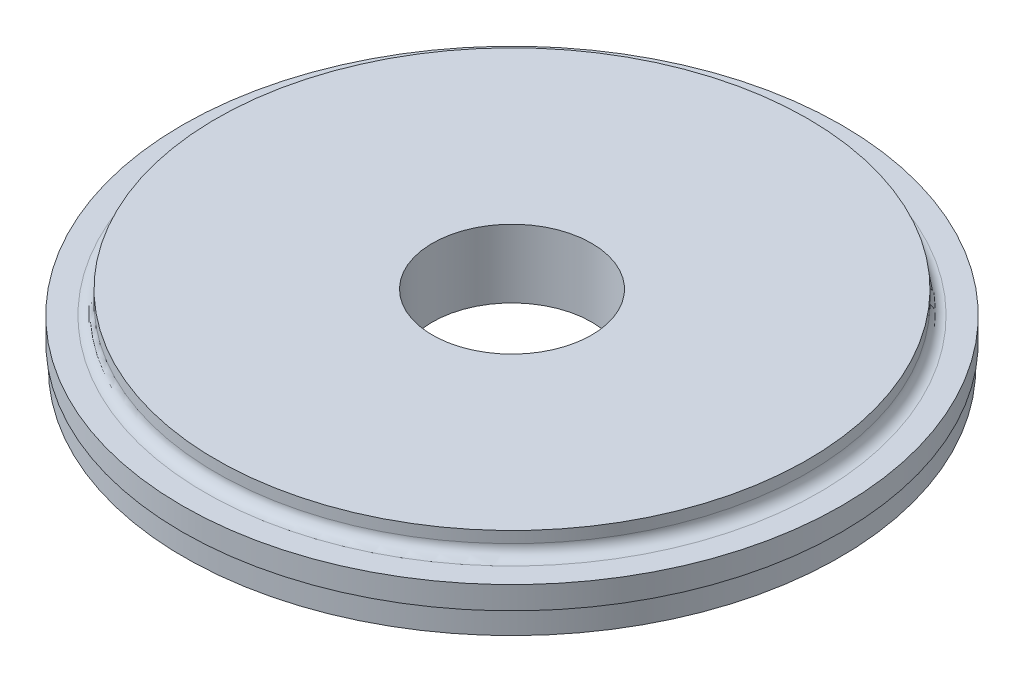
ISO-10303-21;
HEADER;
FILE_DESCRIPTION(('STEP AP214'),'2;1');
FILE_NAME('part.step','',(''),(''),'','','');
FILE_SCHEMA(('AUTOMOTIVE_DESIGN { 1 0 10303 214 1 1 1 1 }'));
ENDSEC;
DATA;
#1=APPLICATION_CONTEXT('core data for automotive mechanical design processes');
#2=APPLICATION_PROTOCOL_DEFINITION('international standard','automotive_design',2000,#1);
#3=PRODUCT_CONTEXT('',#1,'mechanical');
#4=PRODUCT('Part','Part','',(#3));
#5=PRODUCT_RELATED_PRODUCT_CATEGORY('part','',(#4));
#6=PRODUCT_DEFINITION_FORMATION('','',#4);
#7=PRODUCT_DEFINITION_CONTEXT('part definition',#1,'design');
#8=PRODUCT_DEFINITION('design','',#6,#7);
#9=PRODUCT_DEFINITION_SHAPE('','',#8);
#10=(LENGTH_UNIT() NAMED_UNIT(*) SI_UNIT(.MILLI.,.METRE.));
#11=(NAMED_UNIT(*) PLANE_ANGLE_UNIT() SI_UNIT($,.RADIAN.));
#12=(NAMED_UNIT(*) SI_UNIT($,.STERADIAN.) SOLID_ANGLE_UNIT());
#13=UNCERTAINTY_MEASURE_WITH_UNIT(LENGTH_MEASURE(1.E-05),#10,'distance_accuracy_value','');
#14=(GEOMETRIC_REPRESENTATION_CONTEXT(3) GLOBAL_UNCERTAINTY_ASSIGNED_CONTEXT((#13)) GLOBAL_UNIT_ASSIGNED_CONTEXT((#10,
#11,#12)) REPRESENTATION_CONTEXT('',''));
#15=CARTESIAN_POINT('',(0.,0.,0.));
#16=DIRECTION('',(0.,0.,1.));
#17=DIRECTION('',(1.,0.,0.));
#18=AXIS2_PLACEMENT_3D('',#15,#16,#17);
#19=CARTESIAN_POINT('',(0.,15.,65.));
#20=DIRECTION('',(0.,-1.,0.));
#21=DIRECTION('',(0.,0.,-1.));
#22=AXIS2_PLACEMENT_3D('',#19,#20,#21);
#23=PLANE('',#22);
#24=CARTESIAN_POINT('',(0.,15.,0.));
#25=DIRECTION('',(0.,-1.,0.));
#26=DIRECTION('',(0.,0.,-1.));
#27=AXIS2_PLACEMENT_3D('',#24,#25,#26);
#28=CIRCLE('',#27,65.);
#29=CARTESIAN_POINT('',(0.,15.,-65.));
#30=VERTEX_POINT('',#29);
#31=EDGE_CURVE('E10',#30,#30,#28,.T.);
#32=ORIENTED_EDGE('',*,*,#31,.F.);
#33=EDGE_LOOP('',(#32));
#34=FACE_BOUND('',#33,.T.);
#35=CARTESIAN_POINT('',(0.,15.,0.));
#36=DIRECTION('',(0.,-1.,0.));
#37=DIRECTION('',(0.,0.,-1.));
#38=AXIS2_PLACEMENT_3D('',#35,#36,#37);
#39=CIRCLE('',#38,17.5);
#40=CARTESIAN_POINT('',(0.,15.,-17.5));
#41=VERTEX_POINT('',#40);
#42=EDGE_CURVE('E65',#41,#41,#39,.T.);
#43=ORIENTED_EDGE('',*,*,#42,.T.);
#44=EDGE_LOOP('',(#43));
#45=FACE_BOUND('',#44,.T.);
#46=ADVANCED_FACE('F34',(#34,#45),#23,.F.);
#47=CARTESIAN_POINT('',(0.,0.,0.));
#48=DIRECTION('',(0.,-1.,0.));
#49=DIRECTION('',(0.,0.,-1.));
#50=AXIS2_PLACEMENT_3D('',#47,#48,#49);
#51=CYLINDRICAL_SURFACE('',#50,65.);
#52=CARTESIAN_POINT('',(0.,12.5,0.));
#53=DIRECTION('',(0.,-1.,0.));
#54=DIRECTION('',(0.,0.,-1.));
#55=AXIS2_PLACEMENT_3D('',#52,#53,#54);
#56=CIRCLE('',#55,65.);
#57=CARTESIAN_POINT('',(0.,12.5,-65.));
#58=VERTEX_POINT('',#57);
#59=EDGE_CURVE('E40',#58,#58,#56,.T.);
#60=ORIENTED_EDGE('',*,*,#59,.F.);
#61=EDGE_LOOP('',(#60));
#62=FACE_BOUND('',#61,.T.);
#63=ORIENTED_EDGE('',*,*,#31,.T.);
#64=EDGE_LOOP('',(#63));
#65=FACE_BOUND('',#64,.T.);
#66=ADVANCED_FACE('F108',(#62,#65),#51,.T.);
#67=CARTESIAN_POINT('',(0.,12.5,0.));
#68=DIRECTION('',(0.,-1.,0.));
#69=DIRECTION('',(0.,0.,-1.));
#70=AXIS2_PLACEMENT_3D('',#67,#68,#69);
#71=TOROIDAL_SURFACE('',#70,67.5,2.5);
#72=CARTESIAN_POINT('',(0.,9.99999999999999,0.));
#73=DIRECTION('',(0.,-1.,0.));
#74=DIRECTION('',(0.,0.,-1.));
#75=AXIS2_PLACEMENT_3D('',#72,#73,#74);
#76=CIRCLE('',#75,67.5);
#77=CARTESIAN_POINT('',(0.,9.99999999999999,-67.5));
#78=VERTEX_POINT('',#77);
#79=EDGE_CURVE('E44',#78,#78,#76,.T.);
#80=ORIENTED_EDGE('',*,*,#79,.F.);
#81=EDGE_LOOP('',(#80));
#82=FACE_BOUND('',#81,.T.);
#83=ORIENTED_EDGE('',*,*,#59,.T.);
#84=EDGE_LOOP('',(#83));
#85=FACE_BOUND('',#84,.T.);
#86=ADVANCED_FACE('F103',(#82,#85),#71,.F.);
#87=CARTESIAN_POINT('',(0.,9.99999999999999,72.5));
#88=DIRECTION('',(0.,-1.,0.));
#89=DIRECTION('',(0.,0.,-1.));
#90=AXIS2_PLACEMENT_3D('',#87,#88,#89);
#91=PLANE('',#90);
#92=CARTESIAN_POINT('',(0.,9.99999999999999,0.));
#93=DIRECTION('',(0.,-1.,0.));
#94=DIRECTION('',(0.,0.,-1.));
#95=AXIS2_PLACEMENT_3D('',#92,#93,#94);
#96=CIRCLE('',#95,72.5);
#97=CARTESIAN_POINT('',(0.,9.99999999999999,-72.5));
#98=VERTEX_POINT('',#97);
#99=EDGE_CURVE('E48',#98,#98,#96,.T.);
#100=ORIENTED_EDGE('',*,*,#99,.F.);
#101=EDGE_LOOP('',(#100));
#102=FACE_BOUND('',#101,.T.);
#103=ORIENTED_EDGE('',*,*,#79,.T.);
#104=EDGE_LOOP('',(#103));
#105=FACE_BOUND('',#104,.T.);
#106=ADVANCED_FACE('F97',(#102,#105),#91,.F.);
#107=CARTESIAN_POINT('',(0.,0.,0.));
#108=DIRECTION('',(0.,-1.,0.));
#109=DIRECTION('',(0.,0.,-1.));
#110=AXIS2_PLACEMENT_3D('',#107,#108,#109);
#111=CYLINDRICAL_SURFACE('',#110,72.5);
#112=CARTESIAN_POINT('',(0.,4.99999999999999,0.));
#113=DIRECTION('',(0.,-1.,0.));
#114=DIRECTION('',(0.,0.,-1.));
#115=AXIS2_PLACEMENT_3D('',#112,#113,#114);
#116=CIRCLE('',#115,72.5);
#117=CARTESIAN_POINT('',(0.,4.99999999999999,-72.5));
#118=VERTEX_POINT('',#117);
#119=EDGE_CURVE('E53',#118,#118,#116,.T.);
#120=ORIENTED_EDGE('',*,*,#119,.F.);
#121=EDGE_LOOP('',(#120));
#122=FACE_BOUND('',#121,.T.);
#123=ORIENTED_EDGE('',*,*,#99,.T.);
#124=EDGE_LOOP('',(#123));
#125=FACE_BOUND('',#124,.T.);
#126=ADVANCED_FACE('F91',(#122,#125),#111,.T.);
#127=CARTESIAN_POINT('',(0.,4.99999999999999,72.1));
#128=DIRECTION('',(0.,1.,0.));
#129=DIRECTION('',(0.,0.,1.));
#130=AXIS2_PLACEMENT_3D('',#127,#128,#129);
#131=PLANE('',#130);
#132=CARTESIAN_POINT('',(0.,4.99999999999999,0.));
#133=DIRECTION('',(0.,-1.,0.));
#134=DIRECTION('',(0.,0.,-1.));
#135=AXIS2_PLACEMENT_3D('',#132,#133,#134);
#136=CIRCLE('',#135,72.1);
#137=CARTESIAN_POINT('',(0.,4.99999999999999,-72.1));
#138=VERTEX_POINT('',#137);
#139=EDGE_CURVE('E56',#138,#138,#136,.T.);
#140=ORIENTED_EDGE('',*,*,#139,.F.);
#141=EDGE_LOOP('',(#140));
#142=FACE_BOUND('',#141,.T.);
#143=ORIENTED_EDGE('',*,*,#119,.T.);
#144=EDGE_LOOP('',(#143));
#145=FACE_BOUND('',#144,.T.);
#146=ADVANCED_FACE('F85',(#142,#145),#131,.F.);
#147=CARTESIAN_POINT('',(0.,0.,0.));
#148=DIRECTION('',(0.,-1.,0.));
#149=DIRECTION('',(0.,0.,-1.));
#150=AXIS2_PLACEMENT_3D('',#147,#148,#149);
#151=CYLINDRICAL_SURFACE('',#150,72.1);
#152=CARTESIAN_POINT('',(0.,0.,0.));
#153=DIRECTION('',(0.,-1.,0.));
#154=DIRECTION('',(0.,0.,-1.));
#155=AXIS2_PLACEMENT_3D('',#152,#153,#154);
#156=CIRCLE('',#155,72.1);
#157=CARTESIAN_POINT('',(0.,0.,-72.1));
#158=VERTEX_POINT('',#157);
#159=EDGE_CURVE('E59',#158,#158,#156,.T.);
#160=ORIENTED_EDGE('',*,*,#159,.F.);
#161=EDGE_LOOP('',(#160));
#162=FACE_BOUND('',#161,.T.);
#163=ORIENTED_EDGE('',*,*,#139,.T.);
#164=EDGE_LOOP('',(#163));
#165=FACE_BOUND('',#164,.T.);
#166=ADVANCED_FACE('F79',(#162,#165),#151,.T.);
#167=CARTESIAN_POINT('',(0.,0.,17.5));
#168=DIRECTION('',(0.,1.,0.));
#169=DIRECTION('',(0.,0.,1.));
#170=AXIS2_PLACEMENT_3D('',#167,#168,#169);
#171=PLANE('',#170);
#172=CARTESIAN_POINT('',(0.,0.,0.));
#173=DIRECTION('',(0.,-1.,0.));
#174=DIRECTION('',(0.,0.,-1.));
#175=AXIS2_PLACEMENT_3D('',#172,#173,#174);
#176=CIRCLE('',#175,17.5);
#177=CARTESIAN_POINT('',(0.,0.,-17.5));
#178=VERTEX_POINT('',#177);
#179=EDGE_CURVE('E62',#178,#178,#176,.T.);
#180=ORIENTED_EDGE('',*,*,#179,.F.);
#181=EDGE_LOOP('',(#180));
#182=FACE_BOUND('',#181,.T.);
#183=ORIENTED_EDGE('',*,*,#159,.T.);
#184=EDGE_LOOP('',(#183));
#185=FACE_BOUND('',#184,.T.);
#186=ADVANCED_FACE('F73',(#182,#185),#171,.F.);
#187=CARTESIAN_POINT('',(0.,0.,0.));
#188=DIRECTION('',(0.,-1.,0.));
#189=DIRECTION('',(0.,0.,-1.));
#190=AXIS2_PLACEMENT_3D('',#187,#188,#189);
#191=CYLINDRICAL_SURFACE('',#190,17.5);
#192=ORIENTED_EDGE('',*,*,#42,.F.);
#193=EDGE_LOOP('',(#192));
#194=FACE_BOUND('',#193,.T.);
#195=ORIENTED_EDGE('',*,*,#179,.T.);
#196=EDGE_LOOP('',(#195));
#197=FACE_BOUND('',#196,.T.);
#198=ADVANCED_FACE('F70',(#194,#197),#191,.F.);
#199=CLOSED_SHELL('',(#46,#66,#86,#106,#126,#146,#166,#186,#198));
#200=MANIFOLD_SOLID_BREP('B2',#199);
#201=ADVANCED_BREP_SHAPE_REPRESENTATION('',(#18,#200),#14);
#202=SHAPE_DEFINITION_REPRESENTATION(#9,#201);
ENDSEC;
END-ISO-10303-21;
